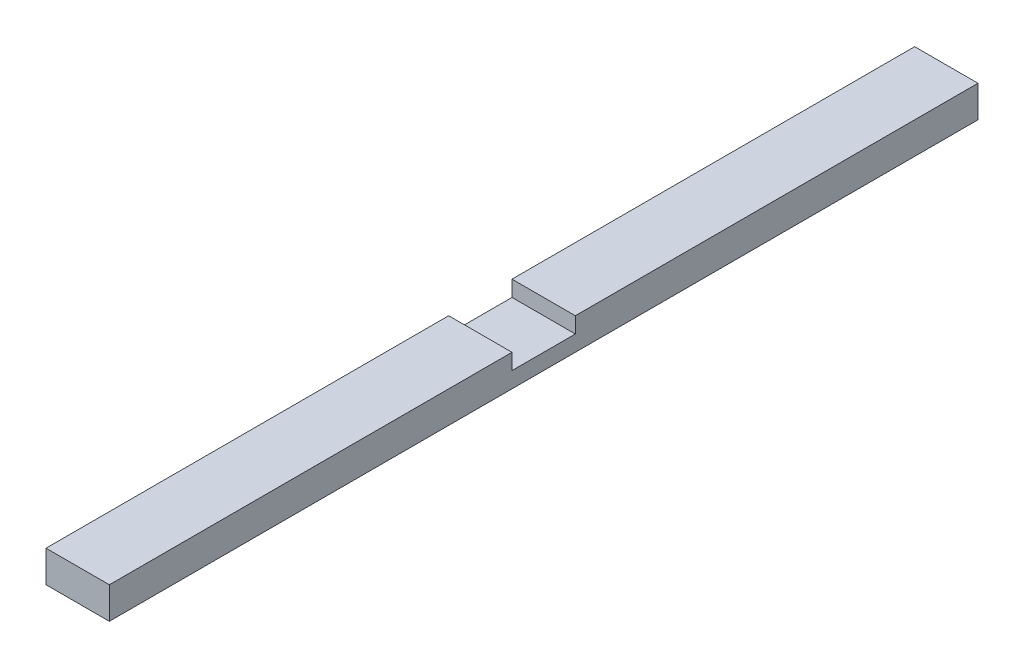
ISO-10303-21;
HEADER;
FILE_DESCRIPTION(('STEP AP214'),'2;1');
FILE_NAME('part.step','',(''),(''),'','','');
FILE_SCHEMA(('AUTOMOTIVE_DESIGN { 1 0 10303 214 1 1 1 1 }'));
ENDSEC;
DATA;
#1=APPLICATION_CONTEXT('core data for automotive mechanical design processes');
#2=APPLICATION_PROTOCOL_DEFINITION('international standard','automotive_design',2000,#1);
#3=PRODUCT_CONTEXT('',#1,'mechanical');
#4=PRODUCT('Part','Part','',(#3));
#5=PRODUCT_RELATED_PRODUCT_CATEGORY('part','',(#4));
#6=PRODUCT_DEFINITION_FORMATION('','',#4);
#7=PRODUCT_DEFINITION_CONTEXT('part definition',#1,'design');
#8=PRODUCT_DEFINITION('design','',#6,#7);
#9=PRODUCT_DEFINITION_SHAPE('','',#8);
#10=(LENGTH_UNIT() NAMED_UNIT(*) SI_UNIT(.MILLI.,.METRE.));
#11=(NAMED_UNIT(*) PLANE_ANGLE_UNIT() SI_UNIT($,.RADIAN.));
#12=(NAMED_UNIT(*) SI_UNIT($,.STERADIAN.) SOLID_ANGLE_UNIT());
#13=UNCERTAINTY_MEASURE_WITH_UNIT(LENGTH_MEASURE(1.E-05),#10,'distance_accuracy_value','');
#14=(GEOMETRIC_REPRESENTATION_CONTEXT(3) GLOBAL_UNCERTAINTY_ASSIGNED_CONTEXT((#13)) GLOBAL_UNIT_ASSIGNED_CONTEXT((#10,
#11,#12)) REPRESENTATION_CONTEXT('',''));
#15=CARTESIAN_POINT('',(0.,0.,0.));
#16=DIRECTION('',(0.,0.,1.));
#17=DIRECTION('',(1.,0.,0.));
#18=AXIS2_PLACEMENT_3D('',#15,#16,#17);
#19=CARTESIAN_POINT('',(-44.45,22.225,1219.2));
#20=DIRECTION('',(0.,-1.,0.));
#21=DIRECTION('',(0.,0.,-1.));
#22=AXIS2_PLACEMENT_3D('',#19,#20,#21);
#23=PLANE('',#22);
#24=DIRECTION('',(0.,0.,-1.));
#25=VECTOR('',#24,1.);
#26=CARTESIAN_POINT('',(44.45,22.225,1219.2));
#27=LINE('',#26,#25);
#28=CARTESIAN_POINT('',(44.45,22.225,1219.2));
#29=VERTEX_POINT('',#28);
#30=CARTESIAN_POINT('',(44.45,22.225,654.05));
#31=VERTEX_POINT('',#30);
#32=EDGE_CURVE('E11',#29,#31,#27,.T.);
#33=ORIENTED_EDGE('',*,*,#32,.T.);
#34=DIRECTION('',(1.,0.,0.));
#35=VECTOR('',#34,1.);
#36=CARTESIAN_POINT('',(-44.45,22.225,654.05));
#37=LINE('',#36,#35);
#38=CARTESIAN_POINT('',(-44.45,22.225,654.05));
#39=VERTEX_POINT('',#38);
#40=EDGE_CURVE('E125',#39,#31,#37,.T.);
#41=ORIENTED_EDGE('',*,*,#40,.F.);
#42=DIRECTION('',(0.,0.,-1.));
#43=VECTOR('',#42,1.);
#44=CARTESIAN_POINT('',(-44.45,22.225,1219.2));
#45=LINE('',#44,#43);
#46=CARTESIAN_POINT('',(-44.45,22.225,1219.2));
#47=VERTEX_POINT('',#46);
#48=EDGE_CURVE('E154',#47,#39,#45,.T.);
#49=ORIENTED_EDGE('',*,*,#48,.F.);
#50=DIRECTION('',(-1.,0.,0.));
#51=VECTOR('',#50,1.);
#52=CARTESIAN_POINT('',(-44.45,22.225,1219.2));
#53=LINE('',#52,#51);
#54=EDGE_CURVE('E88',#29,#47,#53,.T.);
#55=ORIENTED_EDGE('',*,*,#54,.F.);
#56=EDGE_LOOP('',(#33,#41,#49,#55));
#57=FACE_BOUND('',#56,.T.);
#58=ADVANCED_FACE('F36',(#57),#23,.F.);
#59=CARTESIAN_POINT('',(44.45,-22.225,1219.2));
#60=DIRECTION('',(-1.,0.,0.));
#61=DIRECTION('',(0.,0.,1.));
#62=AXIS2_PLACEMENT_3D('',#59,#60,#61);
#63=PLANE('',#62);
#64=DIRECTION('',(0.,0.,-1.));
#65=VECTOR('',#64,1.);
#66=CARTESIAN_POINT('',(44.45,0.,654.05));
#67=LINE('',#66,#65);
#68=CARTESIAN_POINT('',(44.45,0.,654.05));
#69=VERTEX_POINT('',#68);
#70=CARTESIAN_POINT('',(44.45,0.,565.15));
#71=VERTEX_POINT('',#70);
#72=EDGE_CURVE('E116',#69,#71,#67,.T.);
#73=ORIENTED_EDGE('',*,*,#72,.F.);
#74=DIRECTION('',(0.,1.,0.));
#75=VECTOR('',#74,1.);
#76=CARTESIAN_POINT('',(44.45,0.,654.05));
#77=LINE('',#76,#75);
#78=EDGE_CURVE('E145',#69,#31,#77,.T.);
#79=ORIENTED_EDGE('',*,*,#78,.T.);
#80=ORIENTED_EDGE('',*,*,#32,.F.);
#81=DIRECTION('',(0.,1.,0.));
#82=VECTOR('',#81,1.);
#83=CARTESIAN_POINT('',(44.45,-22.225,1219.2));
#84=LINE('',#83,#82);
#85=CARTESIAN_POINT('',(44.45,-22.225,1219.2));
#86=VERTEX_POINT('',#85);
#87=EDGE_CURVE('E135',#86,#29,#84,.T.);
#88=ORIENTED_EDGE('',*,*,#87,.F.);
#89=DIRECTION('',(0.,0.,-1.));
#90=VECTOR('',#89,1.);
#91=CARTESIAN_POINT('',(44.45,-22.225,1219.2));
#92=LINE('',#91,#90);
#93=CARTESIAN_POINT('',(44.45,-22.225,0.));
#94=VERTEX_POINT('',#93);
#95=EDGE_CURVE('E141',#86,#94,#92,.T.);
#96=ORIENTED_EDGE('',*,*,#95,.T.);
#97=DIRECTION('',(0.,1.,0.));
#98=VECTOR('',#97,1.);
#99=CARTESIAN_POINT('',(44.45,-22.225,0.));
#100=LINE('',#99,#98);
#101=CARTESIAN_POINT('',(44.45,22.225,0.));
#102=VERTEX_POINT('',#101);
#103=EDGE_CURVE('E142',#94,#102,#100,.T.);
#104=ORIENTED_EDGE('',*,*,#103,.T.);
#105=CARTESIAN_POINT('',(44.45,22.225,565.15));
#106=VERTEX_POINT('',#105);
#107=EDGE_CURVE('E44',#106,#102,#27,.T.);
#108=ORIENTED_EDGE('',*,*,#107,.F.);
#109=DIRECTION('',(0.,1.,0.));
#110=VECTOR('',#109,1.);
#111=CARTESIAN_POINT('',(44.45,0.,565.15));
#112=LINE('',#111,#110);
#113=EDGE_CURVE('E110',#71,#106,#112,.T.);
#114=ORIENTED_EDGE('',*,*,#113,.F.);
#115=EDGE_LOOP('',(#73,#79,#80,#88,#96,#104,#108,#114));
#116=FACE_BOUND('',#115,.T.);
#117=ADVANCED_FACE('F38',(#116),#63,.F.);
#118=CARTESIAN_POINT('',(-44.45,22.225,565.15));
#119=VERTEX_POINT('',#118);
#120=CARTESIAN_POINT('',(-44.45,22.225,0.));
#121=VERTEX_POINT('',#120);
#122=EDGE_CURVE('E153',#119,#121,#45,.T.);
#123=ORIENTED_EDGE('',*,*,#122,.F.);
#124=DIRECTION('',(-1.,0.,0.));
#125=VECTOR('',#124,1.);
#126=CARTESIAN_POINT('',(-44.45,22.225,565.15));
#127=LINE('',#126,#125);
#128=EDGE_CURVE('E175',#106,#119,#127,.T.);
#129=ORIENTED_EDGE('',*,*,#128,.F.);
#130=ORIENTED_EDGE('',*,*,#107,.T.);
#131=DIRECTION('',(-1.,0.,0.));
#132=VECTOR('',#131,1.);
#133=CARTESIAN_POINT('',(-44.45,22.225,0.));
#134=LINE('',#133,#132);
#135=EDGE_CURVE('E144',#102,#121,#134,.T.);
#136=ORIENTED_EDGE('',*,*,#135,.T.);
#137=EDGE_LOOP('',(#123,#129,#130,#136));
#138=FACE_BOUND('',#137,.T.);
#139=ADVANCED_FACE('F165',(#138),#23,.F.);
#140=CARTESIAN_POINT('',(-44.45,-22.225,1219.2));
#141=DIRECTION('',(1.,0.,0.));
#142=DIRECTION('',(0.,0.,-1.));
#143=AXIS2_PLACEMENT_3D('',#140,#141,#142);
#144=PLANE('',#143);
#145=ORIENTED_EDGE('',*,*,#48,.T.);
#146=DIRECTION('',(0.,1.,0.));
#147=VECTOR('',#146,1.);
#148=CARTESIAN_POINT('',(-44.45,0.,654.05));
#149=LINE('',#148,#147);
#150=CARTESIAN_POINT('',(-44.45,0.,654.05));
#151=VERTEX_POINT('',#150);
#152=EDGE_CURVE('E130',#151,#39,#149,.T.);
#153=ORIENTED_EDGE('',*,*,#152,.F.);
#154=DIRECTION('',(0.,0.,1.));
#155=VECTOR('',#154,1.);
#156=CARTESIAN_POINT('',(-44.45,0.,654.05));
#157=LINE('',#156,#155);
#158=CARTESIAN_POINT('',(-44.45,0.,565.15));
#159=VERTEX_POINT('',#158);
#160=EDGE_CURVE('E115',#159,#151,#157,.T.);
#161=ORIENTED_EDGE('',*,*,#160,.F.);
#162=DIRECTION('',(0.,1.,0.));
#163=VECTOR('',#162,1.);
#164=CARTESIAN_POINT('',(-44.45,0.,565.15));
#165=LINE('',#164,#163);
#166=EDGE_CURVE('E113',#159,#119,#165,.T.);
#167=ORIENTED_EDGE('',*,*,#166,.T.);
#168=ORIENTED_EDGE('',*,*,#122,.T.);
#169=DIRECTION('',(0.,-1.,0.));
#170=VECTOR('',#169,1.);
#171=CARTESIAN_POINT('',(-44.45,-22.225,0.));
#172=LINE('',#171,#170);
#173=CARTESIAN_POINT('',(-44.45,-22.225,0.));
#174=VERTEX_POINT('',#173);
#175=EDGE_CURVE('E148',#121,#174,#172,.T.);
#176=ORIENTED_EDGE('',*,*,#175,.T.);
#177=DIRECTION('',(0.,0.,-1.));
#178=VECTOR('',#177,1.);
#179=CARTESIAN_POINT('',(-44.45,-22.225,1219.2));
#180=LINE('',#179,#178);
#181=CARTESIAN_POINT('',(-44.45,-22.225,1219.2));
#182=VERTEX_POINT('',#181);
#183=EDGE_CURVE('E152',#182,#174,#180,.T.);
#184=ORIENTED_EDGE('',*,*,#183,.F.);
#185=DIRECTION('',(0.,-1.,0.));
#186=VECTOR('',#185,1.);
#187=CARTESIAN_POINT('',(-44.45,-22.225,1219.2));
#188=LINE('',#187,#186);
#189=EDGE_CURVE('E138',#47,#182,#188,.T.);
#190=ORIENTED_EDGE('',*,*,#189,.F.);
#191=EDGE_LOOP('',(#145,#153,#161,#167,#168,#176,#184,#190));
#192=FACE_BOUND('',#191,.T.);
#193=ADVANCED_FACE('F160',(#192),#144,.F.);
#194=CARTESIAN_POINT('',(-44.45,-22.225,1219.2));
#195=DIRECTION('',(0.,1.,0.));
#196=DIRECTION('',(0.,0.,1.));
#197=AXIS2_PLACEMENT_3D('',#194,#195,#196);
#198=PLANE('',#197);
#199=DIRECTION('',(1.,0.,0.));
#200=VECTOR('',#199,1.);
#201=CARTESIAN_POINT('',(-44.45,-22.225,0.));
#202=LINE('',#201,#200);
#203=EDGE_CURVE('E81',#174,#94,#202,.T.);
#204=ORIENTED_EDGE('',*,*,#203,.T.);
#205=ORIENTED_EDGE('',*,*,#95,.F.);
#206=DIRECTION('',(1.,0.,0.));
#207=VECTOR('',#206,1.);
#208=CARTESIAN_POINT('',(-44.45,-22.225,1219.2));
#209=LINE('',#208,#207);
#210=EDGE_CURVE('E60',#182,#86,#209,.T.);
#211=ORIENTED_EDGE('',*,*,#210,.F.);
#212=ORIENTED_EDGE('',*,*,#183,.T.);
#213=EDGE_LOOP('',(#204,#205,#211,#212));
#214=FACE_BOUND('',#213,.T.);
#215=ADVANCED_FACE('F171',(#214),#198,.F.);
#216=CARTESIAN_POINT('',(0.,0.,1219.2));
#217=DIRECTION('',(0.,0.,-1.));
#218=DIRECTION('',(-1.,0.,0.));
#219=AXIS2_PLACEMENT_3D('',#216,#217,#218);
#220=PLANE('',#219);
#221=ORIENTED_EDGE('',*,*,#87,.T.);
#222=ORIENTED_EDGE('',*,*,#54,.T.);
#223=ORIENTED_EDGE('',*,*,#189,.T.);
#224=ORIENTED_EDGE('',*,*,#210,.T.);
#225=EDGE_LOOP('',(#221,#222,#223,#224));
#226=FACE_BOUND('',#225,.T.);
#227=ADVANCED_FACE('F172',(#226),#220,.F.);
#228=CARTESIAN_POINT('',(0.,0.,0.));
#229=DIRECTION('',(0.,0.,-1.));
#230=DIRECTION('',(-1.,0.,0.));
#231=AXIS2_PLACEMENT_3D('',#228,#229,#230);
#232=PLANE('',#231);
#233=ORIENTED_EDGE('',*,*,#103,.F.);
#234=ORIENTED_EDGE('',*,*,#203,.F.);
#235=ORIENTED_EDGE('',*,*,#175,.F.);
#236=ORIENTED_EDGE('',*,*,#135,.F.);
#237=EDGE_LOOP('',(#233,#234,#235,#236));
#238=FACE_BOUND('',#237,.T.);
#239=ADVANCED_FACE('F168',(#238),#232,.T.);
#240=CARTESIAN_POINT('',(-44.45,0.,654.05));
#241=DIRECTION('',(0.,0.,1.));
#242=DIRECTION('',(1.,0.,0.));
#243=AXIS2_PLACEMENT_3D('',#240,#241,#242);
#244=PLANE('',#243);
#245=ORIENTED_EDGE('',*,*,#40,.T.);
#246=ORIENTED_EDGE('',*,*,#78,.F.);
#247=DIRECTION('',(1.,0.,0.));
#248=VECTOR('',#247,1.);
#249=CARTESIAN_POINT('',(-44.45,0.,654.05));
#250=LINE('',#249,#248);
#251=EDGE_CURVE('E122',#151,#69,#250,.T.);
#252=ORIENTED_EDGE('',*,*,#251,.F.);
#253=ORIENTED_EDGE('',*,*,#152,.T.);
#254=EDGE_LOOP('',(#245,#246,#252,#253));
#255=FACE_BOUND('',#254,.T.);
#256=ADVANCED_FACE('F179',(#255),#244,.F.);
#257=CARTESIAN_POINT('',(-44.45,0.,565.15));
#258=DIRECTION('',(0.,0.,-1.));
#259=DIRECTION('',(-1.,0.,0.));
#260=AXIS2_PLACEMENT_3D('',#257,#258,#259);
#261=PLANE('',#260);
#262=ORIENTED_EDGE('',*,*,#128,.T.);
#263=ORIENTED_EDGE('',*,*,#166,.F.);
#264=DIRECTION('',(-1.,0.,0.));
#265=VECTOR('',#264,1.);
#266=CARTESIAN_POINT('',(-44.45,0.,565.15));
#267=LINE('',#266,#265);
#268=EDGE_CURVE('E51',#71,#159,#267,.T.);
#269=ORIENTED_EDGE('',*,*,#268,.F.);
#270=ORIENTED_EDGE('',*,*,#113,.T.);
#271=EDGE_LOOP('',(#262,#263,#269,#270));
#272=FACE_BOUND('',#271,.T.);
#273=ADVANCED_FACE('F108',(#272),#261,.F.);
#274=CARTESIAN_POINT('',(0.,0.,0.));
#275=DIRECTION('',(0.,-1.,0.));
#276=DIRECTION('',(0.,0.,-1.));
#277=AXIS2_PLACEMENT_3D('',#274,#275,#276);
#278=PLANE('',#277);
#279=ORIENTED_EDGE('',*,*,#72,.T.);
#280=ORIENTED_EDGE('',*,*,#268,.T.);
#281=ORIENTED_EDGE('',*,*,#160,.T.);
#282=ORIENTED_EDGE('',*,*,#251,.T.);
#283=EDGE_LOOP('',(#279,#280,#281,#282));
#284=FACE_BOUND('',#283,.T.);
#285=ADVANCED_FACE('F120',(#284),#278,.F.);
#286=CLOSED_SHELL('',(#58,#117,#139,#193,#215,#227,#239,#256,#273,#285));
#287=MANIFOLD_SOLID_BREP('B2',#286);
#288=ADVANCED_BREP_SHAPE_REPRESENTATION('',(#18,#287),#14);
#289=SHAPE_DEFINITION_REPRESENTATION(#9,#288);
ENDSEC;
END-ISO-10303-21;
